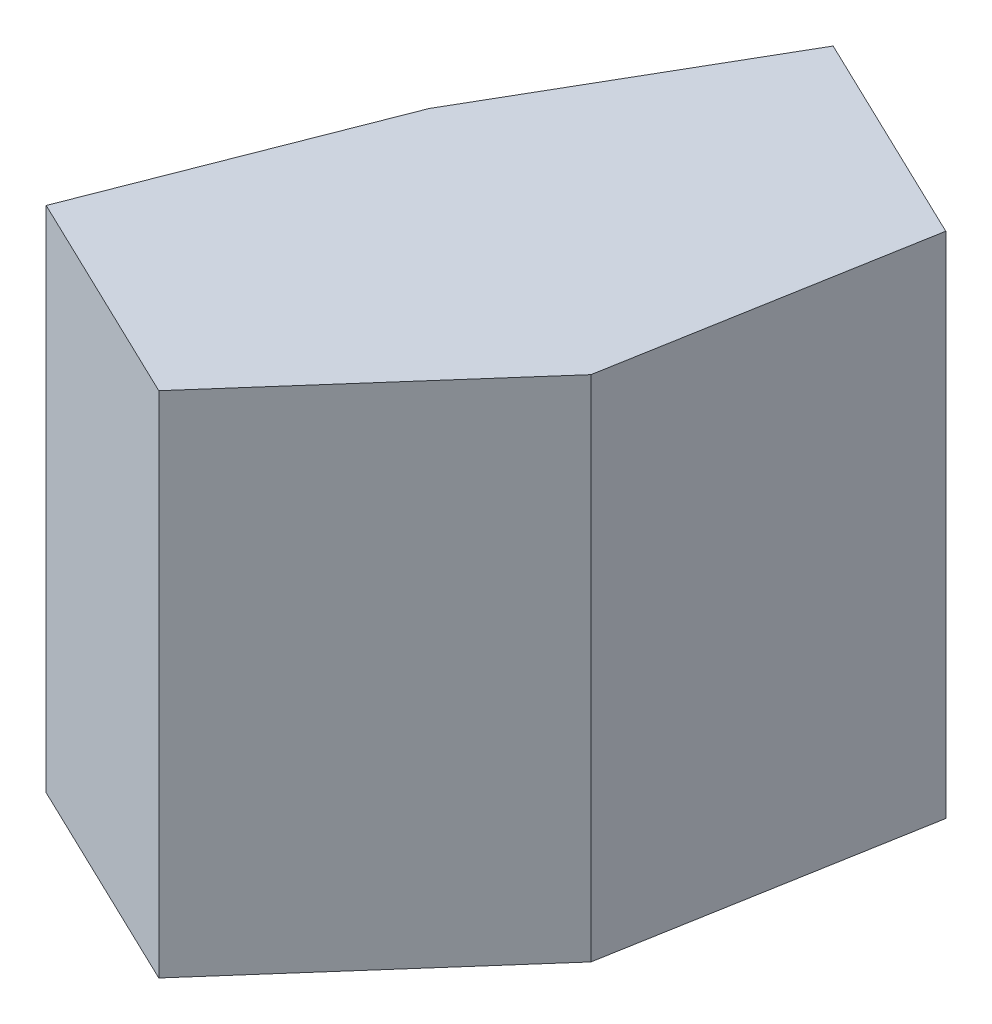
ISO-10303-21;
HEADER;
FILE_DESCRIPTION(('STEP AP214'),'2;1');
FILE_NAME('part.step','',(''),(''),'','','');
FILE_SCHEMA(('AUTOMOTIVE_DESIGN { 1 0 10303 214 1 1 1 1 }'));
ENDSEC;
DATA;
#1=APPLICATION_CONTEXT('core data for automotive mechanical design processes');
#2=APPLICATION_PROTOCOL_DEFINITION('international standard','automotive_design',2000,#1);
#3=PRODUCT_CONTEXT('',#1,'mechanical');
#4=PRODUCT('Part','Part','',(#3));
#5=PRODUCT_RELATED_PRODUCT_CATEGORY('part','',(#4));
#6=PRODUCT_DEFINITION_FORMATION('','',#4);
#7=PRODUCT_DEFINITION_CONTEXT('part definition',#1,'design');
#8=PRODUCT_DEFINITION('design','',#6,#7);
#9=PRODUCT_DEFINITION_SHAPE('','',#8);
#10=(LENGTH_UNIT() NAMED_UNIT(*) SI_UNIT(.MILLI.,.METRE.));
#11=(NAMED_UNIT(*) PLANE_ANGLE_UNIT() SI_UNIT($,.RADIAN.));
#12=(NAMED_UNIT(*) SI_UNIT($,.STERADIAN.) SOLID_ANGLE_UNIT());
#13=UNCERTAINTY_MEASURE_WITH_UNIT(LENGTH_MEASURE(1.E-05),#10,'distance_accuracy_value','');
#14=(GEOMETRIC_REPRESENTATION_CONTEXT(3) GLOBAL_UNCERTAINTY_ASSIGNED_CONTEXT((#13)) GLOBAL_UNIT_ASSIGNED_CONTEXT((#10,
#11,#12)) REPRESENTATION_CONTEXT('',''));
#15=CARTESIAN_POINT('',(0.,0.,0.));
#16=DIRECTION('',(0.,0.,1.));
#17=DIRECTION('',(1.,0.,0.));
#18=AXIS2_PLACEMENT_3D('',#15,#16,#17);
#19=CARTESIAN_POINT('',(-12.4293684892744,6.5,21.5282977294188));
#20=DIRECTION('',(0.866025403784439,0.,0.5));
#21=DIRECTION('',(0.5,0.,-0.866025403784439));
#22=AXIS2_PLACEMENT_3D('',#19,#20,#21);
#23=PLANE('',#22);
#24=DIRECTION('',(-0.5,0.,0.866025403784439));
#25=VECTOR('',#24,1.);
#26=CARTESIAN_POINT('',(-12.4293684892744,-6.5,21.5282977294188));
#27=LINE('',#26,#25);
#28=CARTESIAN_POINT('',(-8.65029030985652,-6.5,14.9827423168922));
#29=VERTEX_POINT('',#28);
#30=CARTESIAN_POINT('',(-12.4293684892744,-6.5,21.5282977294188));
#31=VERTEX_POINT('',#30);
#32=EDGE_CURVE('E134',#29,#31,#27,.T.);
#33=ORIENTED_EDGE('',*,*,#32,.T.);
#34=DIRECTION('',(0.,-1.,0.));
#35=VECTOR('',#34,1.);
#36=CARTESIAN_POINT('',(-12.4293684892744,6.5,21.5282977294188));
#37=LINE('',#36,#35);
#38=CARTESIAN_POINT('',(-12.4293684892744,6.5,21.5282977294188));
#39=VERTEX_POINT('',#38);
#40=EDGE_CURVE('E131',#39,#31,#37,.T.);
#41=ORIENTED_EDGE('',*,*,#40,.F.);
#42=DIRECTION('',(-0.5,0.,0.866025403784439));
#43=VECTOR('',#42,1.);
#44=CARTESIAN_POINT('',(-12.4293684892744,6.5,21.5282977294188));
#45=LINE('',#44,#43);
#46=CARTESIAN_POINT('',(-8.65029030985652,6.5,14.9827423168922));
#47=VERTEX_POINT('',#46);
#48=EDGE_CURVE('E79',#47,#39,#45,.T.);
#49=ORIENTED_EDGE('',*,*,#48,.F.);
#50=DIRECTION('',(0.,-1.,0.));
#51=VECTOR('',#50,1.);
#52=CARTESIAN_POINT('',(-8.65029030985652,6.5,14.9827423168922));
#53=LINE('',#52,#51);
#54=EDGE_CURVE('E47',#47,#29,#53,.T.);
#55=ORIENTED_EDGE('',*,*,#54,.T.);
#56=EDGE_LOOP('',(#33,#41,#49,#55));
#57=FACE_BOUND('',#56,.T.);
#58=ADVANCED_FACE('F39',(#57),#23,.F.);
#59=CARTESIAN_POINT('',(-3.11090546385127,6.5,17.6428215996887));
#60=DIRECTION('',(-0.984807753012207,0.,-0.173648177666934));
#61=DIRECTION('',(-0.173648177666934,0.,0.984807753012208));
#62=AXIS2_PLACEMENT_3D('',#59,#60,#61);
#63=PLANE('',#62);
#64=DIRECTION('',(0.173648177666934,0.,-0.984807753012207));
#65=VECTOR('',#64,1.);
#66=CARTESIAN_POINT('',(-3.11090546385127,-6.5,17.6428215996887));
#67=LINE('',#66,#65);
#68=CARTESIAN_POINT('',(-4.47018248166326,-6.5,25.3516646386299));
#69=VERTEX_POINT('',#68);
#70=CARTESIAN_POINT('',(-3.11090546385127,-6.5,17.6428215996887));
#71=VERTEX_POINT('',#70);
#72=EDGE_CURVE('E69',#69,#71,#67,.T.);
#73=ORIENTED_EDGE('',*,*,#72,.T.);
#74=DIRECTION('',(0.,-1.,0.));
#75=VECTOR('',#74,1.);
#76=CARTESIAN_POINT('',(-3.11090546385127,6.5,17.6428215996887));
#77=LINE('',#76,#75);
#78=CARTESIAN_POINT('',(-3.11090546385127,6.5,17.6428215996887));
#79=VERTEX_POINT('',#78);
#80=EDGE_CURVE('E11',#79,#71,#77,.T.);
#81=ORIENTED_EDGE('',*,*,#80,.F.);
#82=DIRECTION('',(0.173648177666934,0.,-0.984807753012207));
#83=VECTOR('',#82,1.);
#84=CARTESIAN_POINT('',(-3.11090546385127,6.5,17.6428215996887));
#85=LINE('',#84,#83);
#86=CARTESIAN_POINT('',(-4.47018248166326,6.5,25.3516646386299));
#87=VERTEX_POINT('',#86);
#88=EDGE_CURVE('E136',#87,#79,#85,.T.);
#89=ORIENTED_EDGE('',*,*,#88,.F.);
#90=DIRECTION('',(0.,-1.,0.));
#91=VECTOR('',#90,1.);
#92=CARTESIAN_POINT('',(-4.47018248166326,6.5,25.3516646386299));
#93=LINE('',#92,#91);
#94=EDGE_CURVE('E117',#87,#69,#93,.T.);
#95=ORIENTED_EDGE('',*,*,#94,.T.);
#96=EDGE_LOOP('',(#73,#81,#89,#95));
#97=FACE_BOUND('',#96,.T.);
#98=ADVANCED_FACE('F159',(#97),#63,.F.);
#99=CARTESIAN_POINT('',(-8.65029030985652,6.5,14.9827423168922));
#100=DIRECTION('',(-0.432886409651446,0.,0.901448476807787));
#101=DIRECTION('',(0.901448476807788,0.,0.432886409651447));
#102=AXIS2_PLACEMENT_3D('',#99,#100,#101);
#103=PLANE('',#102);
#104=DIRECTION('',(-0.901448476807787,0.,-0.432886409651446));
#105=VECTOR('',#104,1.);
#106=CARTESIAN_POINT('',(-8.65029030985652,-6.5,14.9827423168922));
#107=LINE('',#106,#105);
#108=EDGE_CURVE('E74',#71,#29,#107,.T.);
#109=ORIENTED_EDGE('',*,*,#108,.T.);
#110=ORIENTED_EDGE('',*,*,#54,.F.);
#111=DIRECTION('',(-0.901448476807787,0.,-0.432886409651446));
#112=VECTOR('',#111,1.);
#113=CARTESIAN_POINT('',(-8.65029030985652,6.5,14.9827423168922));
#114=LINE('',#113,#112);
#115=EDGE_CURVE('E55',#79,#47,#114,.T.);
#116=ORIENTED_EDGE('',*,*,#115,.F.);
#117=ORIENTED_EDGE('',*,*,#80,.T.);
#118=EDGE_LOOP('',(#109,#110,#116,#117));
#119=FACE_BOUND('',#118,.T.);
#120=ADVANCED_FACE('F164',(#119),#103,.F.);
#121=CARTESIAN_POINT('',(0.,6.5,0.));
#122=DIRECTION('',(0.,1.,0.));
#123=DIRECTION('',(0.,0.,1.));
#124=AXIS2_PLACEMENT_3D('',#121,#122,#123);
#125=PLANE('',#124);
#126=ORIENTED_EDGE('',*,*,#48,.T.);
#127=DIRECTION('',(0.363521392658883,0.,-0.931585850622124));
#128=VECTOR('',#127,1.);
#129=CARTESIAN_POINT('',(-12.4293684892744,6.5,21.5282977294188));
#130=LINE('',#129,#128);
#131=CARTESIAN_POINT('',(-15.1769200147719,6.5,28.5693692500998));
#132=VERTEX_POINT('',#131);
#133=EDGE_CURVE('E104',#132,#39,#130,.T.);
#134=ORIENTED_EDGE('',*,*,#133,.F.);
#135=DIRECTION('',(-0.901336196301574,0.,-0.433120146421994));
#136=VECTOR('',#135,1.);
#137=CARTESIAN_POINT('',(-15.1769200147719,6.5,28.5693692500998));
#138=LINE('',#137,#136);
#139=CARTESIAN_POINT('',(-9.63822513047897,6.5,31.2308848411912));
#140=VERTEX_POINT('',#139);
#141=EDGE_CURVE('E97',#140,#132,#138,.T.);
#142=ORIENTED_EDGE('',*,*,#141,.F.);
#143=DIRECTION('',(-0.66021949632931,0.,0.751072710639038));
#144=VECTOR('',#143,1.);
#145=CARTESIAN_POINT('',(-9.63822513047897,6.5,31.2308848411912));
#146=LINE('',#145,#144);
#147=EDGE_CURVE('E101',#87,#140,#146,.T.);
#148=ORIENTED_EDGE('',*,*,#147,.F.);
#149=ORIENTED_EDGE('',*,*,#88,.T.);
#150=ORIENTED_EDGE('',*,*,#115,.T.);
#151=EDGE_LOOP('',(#126,#134,#142,#148,#149,#150));
#152=FACE_BOUND('',#151,.T.);
#153=ADVANCED_FACE('F99',(#152),#125,.T.);
#154=CARTESIAN_POINT('',(0.,-6.5,0.));
#155=DIRECTION('',(0.,1.,0.));
#156=DIRECTION('',(0.,0.,1.));
#157=AXIS2_PLACEMENT_3D('',#154,#155,#156);
#158=PLANE('',#157);
#159=ORIENTED_EDGE('',*,*,#32,.F.);
#160=ORIENTED_EDGE('',*,*,#108,.F.);
#161=ORIENTED_EDGE('',*,*,#72,.F.);
#162=DIRECTION('',(-0.66021949632931,0.,0.751072710639038));
#163=VECTOR('',#162,1.);
#164=CARTESIAN_POINT('',(-9.63822513047897,-6.5,31.2308848411912));
#165=LINE('',#164,#163);
#166=CARTESIAN_POINT('',(-9.63822513047897,-6.5,31.2308848411912));
#167=VERTEX_POINT('',#166);
#168=EDGE_CURVE('E126',#69,#167,#165,.T.);
#169=ORIENTED_EDGE('',*,*,#168,.T.);
#170=DIRECTION('',(-0.901336196301574,0.,-0.433120146421994));
#171=VECTOR('',#170,1.);
#172=CARTESIAN_POINT('',(-15.1769200147719,-6.5,28.5693692500998));
#173=LINE('',#172,#171);
#174=CARTESIAN_POINT('',(-15.1769200147719,-6.5,28.5693692500998));
#175=VERTEX_POINT('',#174);
#176=EDGE_CURVE('E113',#167,#175,#173,.T.);
#177=ORIENTED_EDGE('',*,*,#176,.T.);
#178=DIRECTION('',(0.363521392658883,0.,-0.931585850622124));
#179=VECTOR('',#178,1.);
#180=CARTESIAN_POINT('',(-12.4293684892744,-6.5,21.5282977294188));
#181=LINE('',#180,#179);
#182=EDGE_CURVE('E123',#175,#31,#181,.T.);
#183=ORIENTED_EDGE('',*,*,#182,.T.);
#184=EDGE_LOOP('',(#159,#160,#161,#169,#177,#183));
#185=FACE_BOUND('',#184,.T.);
#186=ADVANCED_FACE('F144',(#185),#158,.F.);
#187=CARTESIAN_POINT('',(-12.4293684892744,6.5,21.5282977294188));
#188=DIRECTION('',(0.931585850622124,0.,0.363521392658883));
#189=DIRECTION('',(-0.363521392658883,0.,0.931585850622124));
#190=AXIS2_PLACEMENT_3D('',#187,#188,#189);
#191=PLANE('',#190);
#192=ORIENTED_EDGE('',*,*,#182,.F.);
#193=DIRECTION('',(0.,-1.,0.));
#194=VECTOR('',#193,1.);
#195=CARTESIAN_POINT('',(-15.1769200147719,6.5,28.5693692500998));
#196=LINE('',#195,#194);
#197=EDGE_CURVE('E108',#132,#175,#196,.T.);
#198=ORIENTED_EDGE('',*,*,#197,.F.);
#199=ORIENTED_EDGE('',*,*,#133,.T.);
#200=ORIENTED_EDGE('',*,*,#40,.T.);
#201=EDGE_LOOP('',(#192,#198,#199,#200));
#202=FACE_BOUND('',#201,.T.);
#203=ADVANCED_FACE('F147',(#202),#191,.F.);
#204=CARTESIAN_POINT('',(-9.63822513047897,6.5,31.2308848411912));
#205=DIRECTION('',(-0.751072710639038,0.,-0.66021949632931));
#206=DIRECTION('',(0.66021949632931,0.,-0.751072710639038));
#207=AXIS2_PLACEMENT_3D('',#204,#205,#206);
#208=PLANE('',#207);
#209=ORIENTED_EDGE('',*,*,#168,.F.);
#210=ORIENTED_EDGE('',*,*,#94,.F.);
#211=ORIENTED_EDGE('',*,*,#147,.T.);
#212=DIRECTION('',(0.,-1.,0.));
#213=VECTOR('',#212,1.);
#214=CARTESIAN_POINT('',(-9.63822513047897,6.5,31.2308848411912));
#215=LINE('',#214,#213);
#216=EDGE_CURVE('E111',#140,#167,#215,.T.);
#217=ORIENTED_EDGE('',*,*,#216,.T.);
#218=EDGE_LOOP('',(#209,#210,#211,#217));
#219=FACE_BOUND('',#218,.T.);
#220=ADVANCED_FACE('F119',(#219),#208,.F.);
#221=CARTESIAN_POINT('',(-15.1769200147719,6.5,28.5693692500998));
#222=DIRECTION('',(0.433120146421994,0.,-0.901336196301574));
#223=DIRECTION('',(0.901336196301574,0.,0.433120146421994));
#224=AXIS2_PLACEMENT_3D('',#221,#222,#223);
#225=PLANE('',#224);
#226=ORIENTED_EDGE('',*,*,#176,.F.);
#227=ORIENTED_EDGE('',*,*,#216,.F.);
#228=ORIENTED_EDGE('',*,*,#141,.T.);
#229=ORIENTED_EDGE('',*,*,#197,.T.);
#230=EDGE_LOOP('',(#226,#227,#228,#229));
#231=FACE_BOUND('',#230,.T.);
#232=ADVANCED_FACE('F112',(#231),#225,.F.);
#233=CLOSED_SHELL('',(#58,#98,#120,#153,#186,#203,#220,#232));
#234=MANIFOLD_SOLID_BREP('B2',#233);
#235=ADVANCED_BREP_SHAPE_REPRESENTATION('',(#18,#234),#14);
#236=SHAPE_DEFINITION_REPRESENTATION(#9,#235);
ENDSEC;
END-ISO-10303-21;
